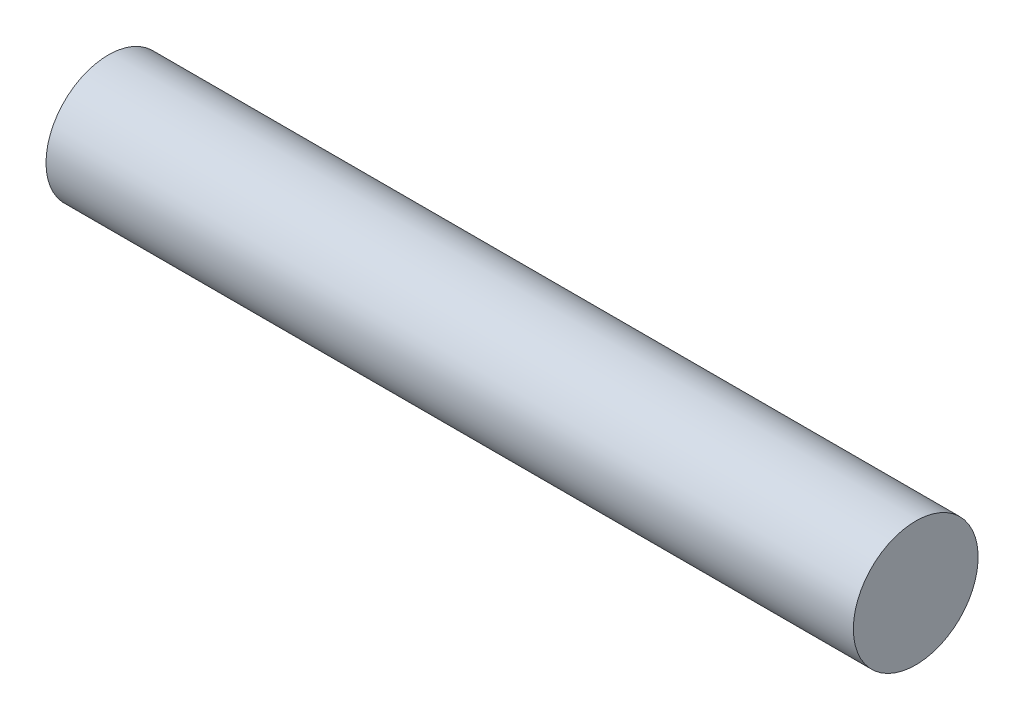
ISO-10303-21;
HEADER;
FILE_DESCRIPTION(('STEP AP214'),'2;1');
FILE_NAME('part.step','',(''),(''),'','','');
FILE_SCHEMA(('AUTOMOTIVE_DESIGN { 1 0 10303 214 1 1 1 1 }'));
ENDSEC;
DATA;
#1=APPLICATION_CONTEXT('core data for automotive mechanical design processes');
#2=APPLICATION_PROTOCOL_DEFINITION('international standard','automotive_design',2000,#1);
#3=PRODUCT_CONTEXT('',#1,'mechanical');
#4=PRODUCT('Part','Part','',(#3));
#5=PRODUCT_RELATED_PRODUCT_CATEGORY('part','',(#4));
#6=PRODUCT_DEFINITION_FORMATION('','',#4);
#7=PRODUCT_DEFINITION_CONTEXT('part definition',#1,'design');
#8=PRODUCT_DEFINITION('design','',#6,#7);
#9=PRODUCT_DEFINITION_SHAPE('','',#8);
#10=(LENGTH_UNIT() NAMED_UNIT(*) SI_UNIT(.MILLI.,.METRE.));
#11=(NAMED_UNIT(*) PLANE_ANGLE_UNIT() SI_UNIT($,.RADIAN.));
#12=(NAMED_UNIT(*) SI_UNIT($,.STERADIAN.) SOLID_ANGLE_UNIT());
#13=UNCERTAINTY_MEASURE_WITH_UNIT(LENGTH_MEASURE(1.E-05),#10,'distance_accuracy_value','');
#14=(GEOMETRIC_REPRESENTATION_CONTEXT(3) GLOBAL_UNCERTAINTY_ASSIGNED_CONTEXT((#13)) GLOBAL_UNIT_ASSIGNED_CONTEXT((#10,
#11,#12)) REPRESENTATION_CONTEXT('',''));
#15=CARTESIAN_POINT('',(0.,0.,0.));
#16=DIRECTION('',(0.,0.,1.));
#17=DIRECTION('',(1.,0.,0.));
#18=AXIS2_PLACEMENT_3D('',#15,#16,#17);
#19=CARTESIAN_POINT('',(0.,0.,0.));
#20=DIRECTION('',(1.,0.,0.));
#21=DIRECTION('',(0.,0.,-1.));
#22=AXIS2_PLACEMENT_3D('',#19,#20,#21);
#23=PLANE('',#22);
#24=CARTESIAN_POINT('',(0.,0.,0.));
#25=DIRECTION('',(-1.,0.,0.));
#26=DIRECTION('',(0.,0.,1.));
#27=AXIS2_PLACEMENT_3D('',#24,#25,#26);
#28=CIRCLE('',#27,1.9685);
#29=CARTESIAN_POINT('',(0.,0.,1.9685));
#30=VERTEX_POINT('',#29);
#31=EDGE_CURVE('E10',#30,#30,#28,.T.);
#32=ORIENTED_EDGE('',*,*,#31,.T.);
#33=EDGE_LOOP('',(#32));
#34=FACE_BOUND('',#33,.T.);
#35=ADVANCED_FACE('F39',(#34),#23,.F.);
#36=CARTESIAN_POINT('',(-5.82780238222876,0.,0.));
#37=DIRECTION('',(-1.,0.,0.));
#38=DIRECTION('',(0.,0.,1.));
#39=AXIS2_PLACEMENT_3D('',#36,#37,#38);
#40=CYLINDRICAL_SURFACE('',#39,1.9685);
#41=ORIENTED_EDGE('',*,*,#31,.F.);
#42=EDGE_LOOP('',(#41));
#43=FACE_BOUND('',#42,.T.);
#44=CARTESIAN_POINT('',(25.4762,0.,0.));
#45=DIRECTION('',(-1.,0.,0.));
#46=DIRECTION('',(0.,0.,1.));
#47=AXIS2_PLACEMENT_3D('',#44,#45,#46);
#48=CIRCLE('',#47,1.9685);
#49=CARTESIAN_POINT('',(25.4762,0.,1.9685));
#50=VERTEX_POINT('',#49);
#51=EDGE_CURVE('E46',#50,#50,#48,.T.);
#52=ORIENTED_EDGE('',*,*,#51,.T.);
#53=EDGE_LOOP('',(#52));
#54=FACE_BOUND('',#53,.T.);
#55=ADVANCED_FACE('F57',(#43,#54),#40,.T.);
#56=CARTESIAN_POINT('',(25.4762,0.,0.));
#57=DIRECTION('',(-1.,0.,0.));
#58=DIRECTION('',(0.,0.,1.));
#59=AXIS2_PLACEMENT_3D('',#56,#57,#58);
#60=PLANE('',#59);
#61=ORIENTED_EDGE('',*,*,#51,.F.);
#62=EDGE_LOOP('',(#61));
#63=FACE_BOUND('',#62,.T.);
#64=ADVANCED_FACE('F59',(#63),#60,.F.);
#65=CLOSED_SHELL('',(#35,#55,#64));
#66=MANIFOLD_SOLID_BREP('B2',#65);
#67=ADVANCED_BREP_SHAPE_REPRESENTATION('',(#18,#66),#14);
#68=SHAPE_DEFINITION_REPRESENTATION(#9,#67);
ENDSEC;
END-ISO-10303-21;
